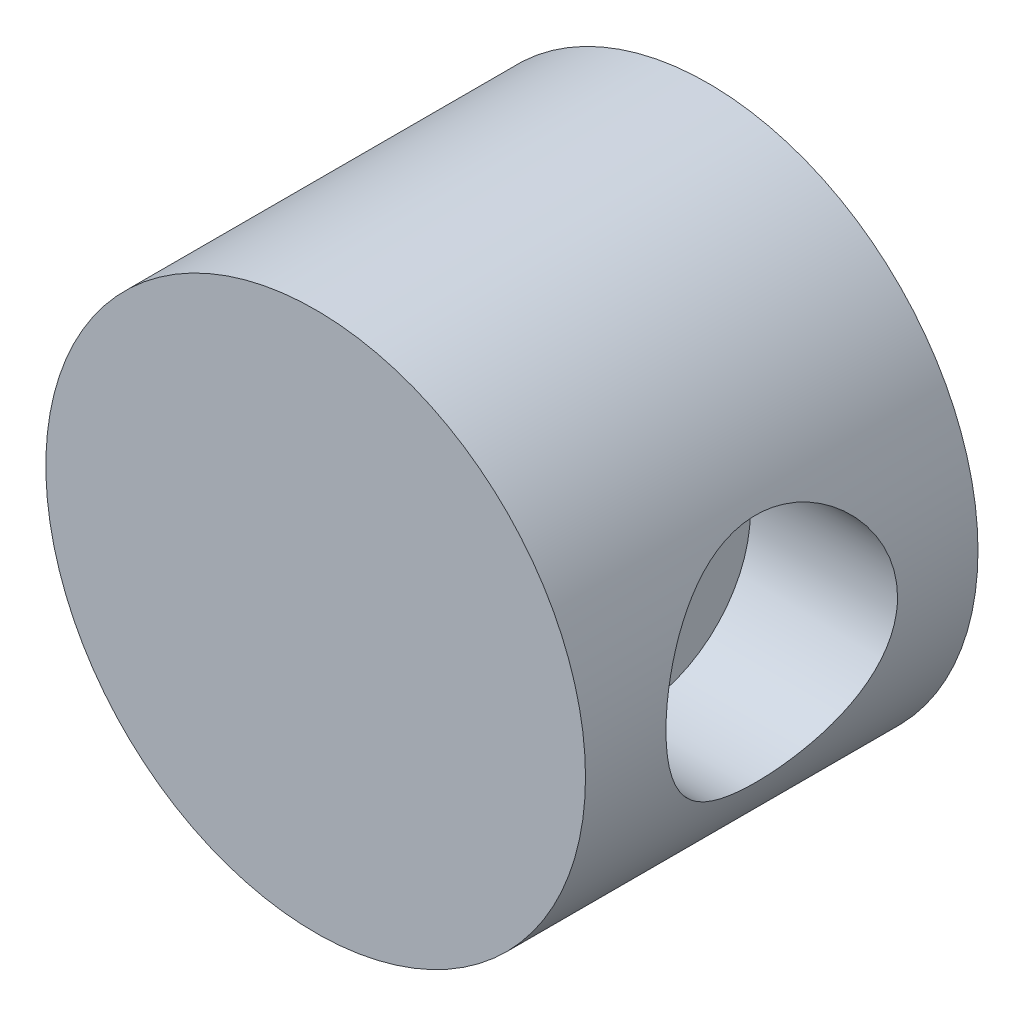
ISO-10303-21;
HEADER;
FILE_DESCRIPTION(('STEP AP214'),'2;1');
FILE_NAME('part.step','',(''),(''),'','','');
FILE_SCHEMA(('AUTOMOTIVE_DESIGN { 1 0 10303 214 1 1 1 1 }'));
ENDSEC;
DATA;
#1=APPLICATION_CONTEXT('core data for automotive mechanical design processes');
#2=APPLICATION_PROTOCOL_DEFINITION('international standard','automotive_design',2000,#1);
#3=PRODUCT_CONTEXT('',#1,'mechanical');
#4=PRODUCT('Part','Part','',(#3));
#5=PRODUCT_RELATED_PRODUCT_CATEGORY('part','',(#4));
#6=PRODUCT_DEFINITION_FORMATION('','',#4);
#7=PRODUCT_DEFINITION_CONTEXT('part definition',#1,'design');
#8=PRODUCT_DEFINITION('design','',#6,#7);
#9=PRODUCT_DEFINITION_SHAPE('','',#8);
#10=(LENGTH_UNIT() NAMED_UNIT(*) SI_UNIT(.MILLI.,.METRE.));
#11=(NAMED_UNIT(*) PLANE_ANGLE_UNIT() SI_UNIT($,.RADIAN.));
#12=(NAMED_UNIT(*) SI_UNIT($,.STERADIAN.) SOLID_ANGLE_UNIT());
#13=UNCERTAINTY_MEASURE_WITH_UNIT(LENGTH_MEASURE(1.E-05),#10,'distance_accuracy_value','');
#14=(GEOMETRIC_REPRESENTATION_CONTEXT(3) GLOBAL_UNCERTAINTY_ASSIGNED_CONTEXT((#13)) GLOBAL_UNIT_ASSIGNED_CONTEXT((#10,
#11,#12)) REPRESENTATION_CONTEXT('',''));
#15=CARTESIAN_POINT('',(0.,0.,0.));
#16=DIRECTION('',(0.,0.,1.));
#17=DIRECTION('',(1.,0.,0.));
#18=AXIS2_PLACEMENT_3D('',#15,#16,#17);
#19=CARTESIAN_POINT('',(0.,0.,40.));
#20=DIRECTION('',(0.,0.,-1.));
#21=DIRECTION('',(-1.,0.,0.));
#22=AXIS2_PLACEMENT_3D('',#19,#20,#21);
#23=CYLINDRICAL_SURFACE('',#22,27.5);
#24=CARTESIAN_POINT('',(-27.5,0.,31.8005203569305));
#25=CARTESIAN_POINT('',(-27.4999981336846,-0.315359693525762,31.800518073135));
#26=CARTESIAN_POINT('',(-27.4945607596565,-0.630814444526596,31.7878618792877));
#27=CARTESIAN_POINT('',(-27.4729463320535,-1.25946707724972,31.7373577506397));
#28=CARTESIAN_POINT('',(-27.456762773426,-1.57266347575706,31.6994945570981));
#29=CARTESIAN_POINT('',(-27.4140342077264,-2.19504661075172,31.5988634095722));
#30=CARTESIAN_POINT('',(-27.3874658935643,-2.50422270002216,31.5360394294279));
#31=CARTESIAN_POINT('',(-27.3246704145355,-3.11557628219286,31.386154666583));
#32=CARTESIAN_POINT('',(-27.2884446683448,-3.41775479595594,31.2990974436613));
#33=CARTESIAN_POINT('',(-27.20739959604,-4.01211457873237,31.1019330014046));
#34=CARTESIAN_POINT('',(-27.1626104788594,-4.30432685771354,30.9919066881672));
#35=CARTESIAN_POINT('',(-27.065460743841,-4.87806343387693,30.7495935202107));
#36=CARTESIAN_POINT('',(-27.0130998712882,-5.15958737109961,30.6173059165945));
#37=CARTESIAN_POINT('',(-26.902091151425,-5.71019537892871,30.3316068420219));
#38=CARTESIAN_POINT('',(-26.8434467501887,-5.97928615352326,30.1782069366799));
#39=CARTESIAN_POINT('',(-26.72119123301,-6.50388482788081,29.8512604812938));
#40=CARTESIAN_POINT('',(-26.6575781773591,-6.75938735685189,29.6777060501428));
#41=CARTESIAN_POINT('',(-26.5237432096869,-7.26727315066893,29.3028664791824));
#42=CARTESIAN_POINT('',(-26.4533508115496,-7.51892720586427,29.1006538460798));
#43=CARTESIAN_POINT('',(-26.3104586772991,-8.00461646980465,28.6765426301811));
#44=CARTESIAN_POINT('',(-26.2379579936512,-8.23864358131999,28.4546351009398));
#45=CARTESIAN_POINT('',(-26.0926784298815,-8.68779997703191,27.9923898963788));
#46=CARTESIAN_POINT('',(-26.0198994673949,-8.902923126952,27.7520462856455));
#47=CARTESIAN_POINT('',(-25.875961430425,-9.31299358560379,27.2542690881751));
#48=CARTESIAN_POINT('',(-25.8048023586208,-9.50794086096864,26.9968354731758));
#49=CARTESIAN_POINT('',(-25.6623057875844,-9.88630803182479,26.452050268744));
#50=CARTESIAN_POINT('',(-25.5911608089139,-10.0685602366403,26.1638354334961));
#51=CARTESIAN_POINT('',(-25.4550362112642,-10.4079084476309,25.5717239065551));
#52=CARTESIAN_POINT('',(-25.3900540336548,-10.5650149124404,25.2678338044352));
#53=CARTESIAN_POINT('',(-25.2684037105102,-10.8527501223478,24.6462200437315));
#54=CARTESIAN_POINT('',(-25.211733929166,-10.9833840789466,24.3284991229376));
#55=CARTESIAN_POINT('',(-25.1087295518504,-11.2168626552605,23.681380259549));
#56=CARTESIAN_POINT('',(-25.0623941336628,-11.3197094858957,23.3519832483388));
#57=CARTESIAN_POINT('',(-24.9838533512609,-11.4919790929248,22.7008084111394));
#58=CARTESIAN_POINT('',(-24.9510557921188,-11.562819685129,22.3794772117039));
#59=CARTESIAN_POINT('',(-24.8975865124204,-11.6775086344832,21.7310291287903));
#60=CARTESIAN_POINT('',(-24.876914397292,-11.721357869957,21.4039124339341));
#61=CARTESIAN_POINT('',(-24.8484944152445,-11.7814870306096,20.7467628982505));
#62=CARTESIAN_POINT('',(-24.8407398851411,-11.7977811694002,20.4167316491947));
#63=CARTESIAN_POINT('',(-24.8384394740922,-11.8026242980561,19.7564288279257));
#64=CARTESIAN_POINT('',(-24.8438928327098,-11.7911748852409,19.4261572706425));
#65=CARTESIAN_POINT('',(-24.8668024955632,-11.7427746617833,18.7953391180539));
#66=CARTESIAN_POINT('',(-24.8832331253325,-11.708002066034,18.4945848939776));
#67=CARTESIAN_POINT('',(-24.9264923756955,-11.6156178399036,17.8973855521384));
#68=CARTESIAN_POINT('',(-24.9533203354498,-11.558007661041,17.6009401617542));
#69=CARTESIAN_POINT('',(-25.0165395049643,-11.4205281392546,17.0142650179302));
#70=CARTESIAN_POINT('',(-25.0529321536717,-11.3406554469663,16.7240362068468));
#71=CARTESIAN_POINT('',(-25.1341925411445,-11.1594004389498,16.1515965995857));
#72=CARTESIAN_POINT('',(-25.179060628662,-11.058017238074,15.8693861339012));
#73=CARTESIAN_POINT('',(-25.2770532388276,-10.8321764542502,15.3085628126987));
#74=CARTESIAN_POINT('',(-25.3303351801876,-10.7072677264411,15.0301593670838));
#75=CARTESIAN_POINT('',(-25.4429678957688,-10.436802240301,14.484735576817));
#76=CARTESIAN_POINT('',(-25.5023208725636,-10.2912379806663,14.2177194136118));
#77=CARTESIAN_POINT('',(-25.625544138322,-9.98045211726002,13.6964333528167));
#78=CARTESIAN_POINT('',(-25.6894150676427,-9.81522772466421,13.4421652708528));
#79=CARTESIAN_POINT('',(-25.8200983635288,-9.46611107967004,12.9475776892844));
#80=CARTESIAN_POINT('',(-25.88691090509,-9.2822177158077,12.7072590215037));
#81=CARTESIAN_POINT('',(-26.0280192955457,-8.87928995643484,12.220597541512));
#82=CARTESIAN_POINT('',(-26.1024453832148,-8.65858151554555,11.9756760992904));
#83=CARTESIAN_POINT('',(-26.250900664879,-8.19749031575243,11.5051845403594));
#84=CARTESIAN_POINT('',(-26.3249300000992,-7.95711513221708,11.2796070405554));
#85=CARTESIAN_POINT('',(-26.4707304989759,-7.45775536775612,10.8488823828617));
#86=CARTESIAN_POINT('',(-26.5425000722295,-7.19875808387329,10.64374940311));
#87=CARTESIAN_POINT('',(-26.6818233780515,-6.66383161935828,10.2555247070997));
#88=CARTESIAN_POINT('',(-26.7493788157012,-6.38790937754001,10.0724240481201));
#89=CARTESIAN_POINT('',(-26.8802161760553,-5.81318064320936,9.72503651996358));
#90=CARTESIAN_POINT('',(-26.9433402049143,-5.51396446840991,9.56136664154595));
#91=CARTESIAN_POINT('',(-27.0615209798565,-4.90116723565635,9.2600084181058));
#92=CARTESIAN_POINT('',(-27.116577498726,-4.58758577344392,9.1223208048177));
#93=CARTESIAN_POINT('',(-27.2169906783099,-3.94841852491678,8.87436686586986));
#94=CARTESIAN_POINT('',(-27.2623519292843,-3.62283850535029,8.7640875596021));
#95=CARTESIAN_POINT('',(-27.3420368907614,-2.96204733999575,8.57209984883751));
#96=CARTESIAN_POINT('',(-27.3763614977091,-2.62683697883725,8.49038912382679));
#97=CARTESIAN_POINT('',(-27.4310376415615,-1.97202191360785,8.36095776222526));
#98=CARTESIAN_POINT('',(-27.4521644663649,-1.65285528154501,8.31134336314416));
#99=CARTESIAN_POINT('',(-27.4832877721504,-1.01099294083774,8.23843200196534));
#100=CARTESIAN_POINT('',(-27.4932847434176,-0.688297388279497,8.21513388059909));
#101=CARTESIAN_POINT('',(-27.5018662976328,-0.0420189674608372,8.19512765533144));
#102=CARTESIAN_POINT('',(-27.5004539235616,0.281563641198773,8.19841246151114));
#103=CARTESIAN_POINT('',(-27.4862635846183,0.927112360096872,8.23151700186176));
#104=CARTESIAN_POINT('',(-27.4734859013534,1.24907851018885,8.2613360785722));
#105=CARTESIAN_POINT('',(-27.4379035510791,1.8717543492612,8.34486516407671));
#106=CARTESIAN_POINT('',(-27.4156709656317,2.17268079190398,8.39721388063256));
#107=CARTESIAN_POINT('',(-27.3618985964477,2.76876361958969,8.52484752195865));
#108=CARTESIAN_POINT('',(-27.3303592267556,3.06392026069945,8.60013142638264));
#109=CARTESIAN_POINT('',(-27.2587326099299,3.64659778809436,8.77293616326065));
#110=CARTESIAN_POINT('',(-27.2186447516134,3.93411812676054,8.87045858571474));
#111=CARTESIAN_POINT('',(-27.1308647000425,4.4997909529933,9.08689410475198));
#112=CARTESIAN_POINT('',(-27.0831722217244,4.77794308891363,9.20580800322873));
#113=CARTESIAN_POINT('',(-26.9796918508587,5.331794910342,9.46809512031005));
#114=CARTESIAN_POINT('',(-26.9236987776532,5.60715105368804,9.612112485434));
#115=CARTESIAN_POINT('',(-26.8060905137521,6.14485910300472,9.92085597421787));
#116=CARTESIAN_POINT('',(-26.7444732917766,6.40720625728827,10.085589588168));
#117=CARTESIAN_POINT('',(-26.6170479237938,6.91750963360055,10.4346499099423));
#118=CARTESIAN_POINT('',(-26.5512390517016,7.16546334807651,10.6189800160253));
#119=CARTESIAN_POINT('',(-26.4169423560663,7.64574046381944,11.0061087074266));
#120=CARTESIAN_POINT('',(-26.3484543926779,7.8780630474341,11.2089082575633));
#121=CARTESIAN_POINT('',(-26.2051408773667,8.34290911278394,11.6478794860065));
#122=CARTESIAN_POINT('',(-26.1302276923771,8.57411949491422,11.8854150619756));
#123=CARTESIAN_POINT('',(-25.9811206708011,9.01585980507216,12.3792186885803));
#124=CARTESIAN_POINT('',(-25.9069268667099,9.22638880278797,12.6354875809942));
#125=CARTESIAN_POINT('',(-25.7612965026287,9.62552605653066,13.1654128377798));
#126=CARTESIAN_POINT('',(-25.6898606124898,9.81412900918421,13.4390733841128));
#127=CARTESIAN_POINT('',(-25.5518325981401,10.1680850051094,14.0022544780809));
#128=CARTESIAN_POINT('',(-25.4852410075853,10.3334354887178,14.2917767669309));
#129=CARTESIAN_POINT('',(-25.3577989599797,10.6423909986829,14.8904663806869));
#130=CARTESIAN_POINT('',(-25.2970769247382,10.7855391132524,15.1998974163615));
#131=CARTESIAN_POINT('',(-25.1849018514785,11.0449400122799,15.8313064568411));
#132=CARTESIAN_POINT('',(-25.133444525616,11.1612052456505,16.15327857309));
#133=CARTESIAN_POINT('',(-25.0416756843672,11.3656079310105,16.8074167083928));
#134=CARTESIAN_POINT('',(-25.0013585612847,11.4537595381469,17.1395775048249));
#135=CARTESIAN_POINT('',(-24.9334175435301,11.6009175444582,17.8115624851285));
#136=CARTESIAN_POINT('',(-24.905792350628,11.6599269245748,18.1513858814771));
#137=CARTESIAN_POINT('',(-24.8660344374857,11.7444589199865,18.8081181264052));
#138=CARTESIAN_POINT('',(-24.8528323580021,11.7722975028192,19.1246658995802));
#139=CARTESIAN_POINT('',(-24.8385807523395,11.8023385093588,19.7592428529976));
#140=CARTESIAN_POINT('',(-24.8375305450897,11.8045423698041,20.0772719492174));
#141=CARTESIAN_POINT('',(-24.8476199121212,11.7832897486026,20.712220755723));
#142=CARTESIAN_POINT('',(-24.8587575571193,11.7598373282321,21.0291406336277));
#143=CARTESIAN_POINT('',(-24.8928179941944,11.6875661566332,21.6594263815949));
#144=CARTESIAN_POINT('',(-24.9157406551491,11.6387476876324,21.97279229116));
#145=CARTESIAN_POINT('',(-24.9710666172275,11.5195440351879,22.5772541486782));
#146=CARTESIAN_POINT('',(-25.0029072147929,11.4504296780011,22.8686539475978));
#147=CARTESIAN_POINT('',(-25.0754904116916,11.2905925324951,23.4444302123539));
#148=CARTESIAN_POINT('',(-25.1162360666285,11.1998623261374,23.7288042300537));
#149=CARTESIAN_POINT('',(-25.2054562017099,10.9975989553038,24.2887911350942));
#150=CARTESIAN_POINT('',(-25.2539306963139,10.8860657519086,24.5644040060428));
#151=CARTESIAN_POINT('',(-25.3573028936448,10.643054864418,25.1054506085304));
#152=CARTESIAN_POINT('',(-25.4122010900731,10.5115756471168,25.3708835555944));
#153=CARTESIAN_POINT('',(-25.530588763318,10.2208205024736,25.9064037211142));
#154=CARTESIAN_POINT('',(-25.5943999053574,10.0603263628233,26.1757586331021));
#155=CARTESIAN_POINT('',(-25.7259746545615,9.71893436731351,26.7001866816035));
#156=CARTESIAN_POINT('',(-25.7937383830875,9.53803588479376,26.9552593791197));
#157=CARTESIAN_POINT('',(-25.9315069194049,9.15685642295699,27.449952330037));
#158=CARTESIAN_POINT('',(-26.00151232348,8.95657025738712,27.689568420034));
#159=CARTESIAN_POINT('',(-26.1420420910476,8.53770689317832,28.1521293980692));
#160=CARTESIAN_POINT('',(-26.2125665239412,8.31912720637794,28.3750720104591));
#161=CARTESIAN_POINT('',(-26.3580112717159,7.84672271864387,28.8201317465053));
#162=CARTESIAN_POINT('',(-26.4328356026907,7.5914774296087,29.0407756569632));
#163=CARTESIAN_POINT('',(-26.5790534397913,7.06251930044783,29.4597514335358));
#164=CARTESIAN_POINT('',(-26.6504481420655,6.78881298021108,29.6580911115185));
#165=CARTESIAN_POINT('',(-26.7879347274466,6.22422802928004,30.031243222346));
#166=CARTESIAN_POINT('',(-26.8540226766119,5.93333693162152,30.2060382652055));
#167=CARTESIAN_POINT('',(-26.9789922188971,5.33637944743056,30.5304661537099));
#168=CARTESIAN_POINT('',(-27.03787438677,5.0303142739639,30.6801010065571));
#169=CARTESIAN_POINT('',(-27.1459678557145,4.40956184386803,30.9508464085512));
#170=CARTESIAN_POINT('',(-27.1953066892821,4.09506326595642,31.0723381424544));
#171=CARTESIAN_POINT('',(-27.2839505691409,3.4554684082484,31.2883101981054));
#172=CARTESIAN_POINT('',(-27.3232539812619,3.13037041214785,31.3827861208927));
#173=CARTESIAN_POINT('',(-27.3905595961472,2.47307536330899,31.5434110996355));
#174=CARTESIAN_POINT('',(-27.4185928630186,2.1409005186601,31.6096380499537));
#175=CARTESIAN_POINT('',(-27.4626496308576,1.47147024241425,31.7133098858548));
#176=CARTESIAN_POINT('',(-27.4786817376231,1.13421862864034,31.7507753961987));
#177=CARTESIAN_POINT('',(-27.4923149001208,0.663496081326161,31.7826015574181));
#178=CARTESIAN_POINT('',(-27.495194958019,0.530908724201248,31.7893189654418));
#179=CARTESIAN_POINT('',(-27.4990379069738,0.265553196414928,31.7982788602444));
#180=CARTESIAN_POINT('',(-27.5000007858288,0.132785024608134,31.800521318543));
#181=CARTESIAN_POINT('',(-27.5,0.,31.8005203569305));
#182=B_SPLINE_CURVE_WITH_KNOTS('',3,(#24,#25,#26,#27,#28,#29,#30,#31,#32,#33,#34,#35,#36,#37,
#38,#39,#40,#41,#42,#43,#44,#45,#46,#47,#48,#49,#50,#51,#52,#53,#54,#55,#56,#57,#58,#59,#60,#61,
#62,#63,#64,#65,#66,#67,#68,#69,#70,#71,#72,#73,#74,#75,#76,#77,#78,#79,#80,#81,#82,#83,#84,#85,
#86,#87,#88,#89,#90,#91,#92,#93,#94,#95,#96,#97,#98,#99,#100,#101,#102,#103,#104,#105,#106,#107,
#108,#109,#110,#111,#112,#113,#114,#115,#116,#117,#118,#119,#120,#121,#122,#123,#124,#125,#126,
#127,#128,#129,#130,#131,#132,#133,#134,#135,#136,#137,#138,#139,#140,#141,#142,#143,#144,#145,
#146,#147,#148,#149,#150,#151,#152,#153,#154,#155,#156,#157,#158,#159,#160,#161,#162,#163,#164,
#165,#166,#167,#168,#169,#170,#171,#172,#173,#174,#175,#176,#177,#178,#179,#180,#181),
.UNSPECIFIED.,.T.,.F.,(4,2,2,2,2,2,2,2,2,2,2,2,2,2,2,2,2,2,2,2,2,2,2,2,2,2,2,2,2,2,2,2,2,2,2,2,
2,2,2,2,2,2,2,2,2,2,2,2,2,2,2,2,2,2,2,2,2,2,2,2,2,2,2,2,2,2,2,2,2,2,2,2,2,2,2,2,2,2,4),(0.,
0.945944814906931,1.89246276693154,2.84111735411139,3.78963266071268,4.73486165725625,
5.68012245881936,6.62486747928232,7.56998317918924,8.56014920812009,9.55076734678675,
10.5417057599803,11.5326458119604,12.5763863299863,13.6196916002426,14.6627912806206,
15.7058079409094,16.6965055083798,17.6871708359291,18.6773249973408,19.6674221525327,
20.5759656346429,21.4844513805066,22.3930738806396,23.3017337774273,24.2300226505781,
25.1586495098625,26.0874082538759,27.0162223243405,28.0290515502029,29.0414924679674,
30.0546306912927,31.06735629377,32.1065576004454,33.1457881696164,34.1845256159832,
35.2231786701657,36.1929961781953,37.162770962752,38.1322871077019,39.1017792308567,
40.0194830879426,40.9371461239557,41.8548747912328,42.7726378682046,43.7188614764003,
44.6654281958204,45.6121593294596,46.5589399474285,47.577310198921,48.5957262388623,
49.6143880984429,50.6331620060649,51.6707111576524,52.7077788748572,53.7443236034366,
54.7807622824828,55.7336518786826,56.6864880684284,57.6391734502213,58.5918482324719,
59.494364229172,60.3971903948879,61.3000182496728,62.2029155380284,63.1618099333642,
64.120733786388,65.079914866518,66.039226620675,67.0747648734038,68.1099393005597,
69.1458741598787,70.1817263362613,71.2025996314426,72.223639059985,73.2418445594508,
74.2593192223359,74.6576152275074,75.0559137675682),.UNSPECIFIED.);
#183=CARTESIAN_POINT('',(-27.5,0.,31.8005203569305));
#184=VERTEX_POINT('',#183);
#185=EDGE_CURVE('E41',#184,#184,#182,.T.);
#186=ORIENTED_EDGE('',*,*,#185,.T.);
#187=EDGE_LOOP('',(#186));
#188=FACE_BOUND('',#187,.T.);
#189=CARTESIAN_POINT('',(0.,0.,40.));
#190=DIRECTION('',(0.,0.,1.));
#191=DIRECTION('',(1.,0.,0.));
#192=AXIS2_PLACEMENT_3D('',#189,#190,#191);
#193=CIRCLE('',#192,27.5);
#194=CARTESIAN_POINT('',(27.5,0.,40.));
#195=VERTEX_POINT('',#194);
#196=EDGE_CURVE('E45',#195,#195,#193,.T.);
#197=ORIENTED_EDGE('',*,*,#196,.F.);
#198=EDGE_LOOP('',(#197));
#199=FACE_BOUND('',#198,.T.);
#200=CARTESIAN_POINT('',(0.,0.,0.));
#201=DIRECTION('',(0.,0.,1.));
#202=DIRECTION('',(1.,0.,0.));
#203=AXIS2_PLACEMENT_3D('',#200,#201,#202);
#204=CIRCLE('',#203,27.5);
#205=CARTESIAN_POINT('',(27.5,0.,0.));
#206=VERTEX_POINT('',#205);
#207=EDGE_CURVE('E49',#206,#206,#204,.T.);
#208=ORIENTED_EDGE('',*,*,#207,.T.);
#209=EDGE_LOOP('',(#208));
#210=FACE_BOUND('',#209,.T.);
#211=CARTESIAN_POINT('',(27.5,0.,8.19947964306954));
#212=CARTESIAN_POINT('',(27.4999981336846,0.315359693525761,8.19948192686497));
#213=CARTESIAN_POINT('',(27.4945607596565,0.630814444526596,8.21213812071227));
#214=CARTESIAN_POINT('',(27.4729463320535,1.25946707724972,8.26264224936029));
#215=CARTESIAN_POINT('',(27.456762773426,1.57266347575706,8.30050544290192));
#216=CARTESIAN_POINT('',(27.4140342077264,2.19504661075172,8.40113659042777));
#217=CARTESIAN_POINT('',(27.3874658935643,2.50422270002216,8.46396057057212));
#218=CARTESIAN_POINT('',(27.3246704145355,3.11557628219286,8.61384533341702));
#219=CARTESIAN_POINT('',(27.2884446683448,3.41775479595594,8.70090255633867));
#220=CARTESIAN_POINT('',(27.20739959604,4.01211457873237,8.89806699859545));
#221=CARTESIAN_POINT('',(27.1626104788594,4.30432685771354,9.00809331183284));
#222=CARTESIAN_POINT('',(27.065460743841,4.87806343387693,9.25040647978932));
#223=CARTESIAN_POINT('',(27.0130998712882,5.15958737109961,9.38269408340548));
#224=CARTESIAN_POINT('',(26.902091151425,5.71019537892871,9.66839315797811));
#225=CARTESIAN_POINT('',(26.8434467501887,5.97928615352326,9.82179306332014));
#226=CARTESIAN_POINT('',(26.72119123301,6.50388482788081,10.1487395187062));
#227=CARTESIAN_POINT('',(26.6575781773591,6.75938735685189,10.3222939498572));
#228=CARTESIAN_POINT('',(26.5237432096869,7.26727315066893,10.6971335208176));
#229=CARTESIAN_POINT('',(26.4533508115496,7.51892720586427,10.8993461539202));
#230=CARTESIAN_POINT('',(26.3104586772991,8.00461646980465,11.3234573698189));
#231=CARTESIAN_POINT('',(26.2379579936512,8.23864358131999,11.5453648990602));
#232=CARTESIAN_POINT('',(26.0926784298815,8.68779997703191,12.0076101036212));
#233=CARTESIAN_POINT('',(26.0198994673949,8.902923126952,12.2479537143545));
#234=CARTESIAN_POINT('',(25.875961430425,9.31299358560379,12.7457309118249));
#235=CARTESIAN_POINT('',(25.8048023586208,9.50794086096865,13.0031645268242));
#236=CARTESIAN_POINT('',(25.6623057875844,9.88630803182479,13.547949731256));
#237=CARTESIAN_POINT('',(25.5911608089139,10.0685602366403,13.8361645665039));
#238=CARTESIAN_POINT('',(25.4550362112642,10.4079084476309,14.4282760934449));
#239=CARTESIAN_POINT('',(25.3900540336548,10.5650149124404,14.7321661955648));
#240=CARTESIAN_POINT('',(25.2684037105102,10.8527501223478,15.3537799562685));
#241=CARTESIAN_POINT('',(25.211733929166,10.9833840789466,15.6715008770624));
#242=CARTESIAN_POINT('',(25.1087295518504,11.2168626552605,16.318619740451));
#243=CARTESIAN_POINT('',(25.0623941336628,11.3197094858957,16.6480167516612));
#244=CARTESIAN_POINT('',(24.9838533512609,11.4919790929248,17.2991915888606));
#245=CARTESIAN_POINT('',(24.9510557921188,11.562819685129,17.6205227882961));
#246=CARTESIAN_POINT('',(24.8975865124204,11.6775086344832,18.2689708712097));
#247=CARTESIAN_POINT('',(24.876914397292,11.721357869957,18.5960875660659));
#248=CARTESIAN_POINT('',(24.8484944152445,11.7814870306096,19.2532371017495));
#249=CARTESIAN_POINT('',(24.8407398851411,11.7977811694002,19.5832683508053));
#250=CARTESIAN_POINT('',(24.8384394740922,11.8026242980561,20.2435711720743));
#251=CARTESIAN_POINT('',(24.8438928327098,11.7911748852409,20.5738427293575));
#252=CARTESIAN_POINT('',(24.8668024955632,11.7427746617833,21.2046608819461));
#253=CARTESIAN_POINT('',(24.8832331253325,11.708002066034,21.5054151060224));
#254=CARTESIAN_POINT('',(24.9264923756955,11.6156178399036,22.1026144478616));
#255=CARTESIAN_POINT('',(24.9533203354498,11.558007661041,22.3990598382458));
#256=CARTESIAN_POINT('',(25.0165395049643,11.4205281392546,22.9857349820698));
#257=CARTESIAN_POINT('',(25.0529321536717,11.3406554469663,23.2759637931532));
#258=CARTESIAN_POINT('',(25.1341925411445,11.1594004389498,23.8484034004143));
#259=CARTESIAN_POINT('',(25.179060628662,11.058017238074,24.1306138660988));
#260=CARTESIAN_POINT('',(25.2770532388276,10.8321764542502,24.6914371873013));
#261=CARTESIAN_POINT('',(25.3303351801876,10.7072677264411,24.9698406329162));
#262=CARTESIAN_POINT('',(25.4429678957688,10.436802240301,25.515264423183));
#263=CARTESIAN_POINT('',(25.5023208725636,10.2912379806664,25.7822805863882));
#264=CARTESIAN_POINT('',(25.625544138322,9.98045211726002,26.3035666471833));
#265=CARTESIAN_POINT('',(25.6894150676427,9.81522772466421,26.5578347291472));
#266=CARTESIAN_POINT('',(25.8200983635288,9.46611107967004,27.0524223107156));
#267=CARTESIAN_POINT('',(25.88691090509,9.2822177158077,27.2927409784963));
#268=CARTESIAN_POINT('',(26.0280192955457,8.87928995643484,27.779402458488));
#269=CARTESIAN_POINT('',(26.1024453832148,8.65858151554555,28.0243239007096));
#270=CARTESIAN_POINT('',(26.250900664879,8.19749031575243,28.4948154596406));
#271=CARTESIAN_POINT('',(26.3249300000992,7.95711513221708,28.7203929594446));
#272=CARTESIAN_POINT('',(26.4707304989759,7.45775536775612,29.1511176171383));
#273=CARTESIAN_POINT('',(26.5425000722295,7.19875808387329,29.35625059689));
#274=CARTESIAN_POINT('',(26.6818233780515,6.66383161935828,29.7444752929003));
#275=CARTESIAN_POINT('',(26.7493788157012,6.38790937754001,29.9275759518799));
#276=CARTESIAN_POINT('',(26.8802161760553,5.81318064320936,30.2749634800364));
#277=CARTESIAN_POINT('',(26.9433402049143,5.51396446840991,30.4386333584541));
#278=CARTESIAN_POINT('',(27.0615209798565,4.90116723565635,30.7399915818942));
#279=CARTESIAN_POINT('',(27.116577498726,4.58758577344392,30.8776791951823));
#280=CARTESIAN_POINT('',(27.2169906783099,3.94841852491677,31.1256331341301));
#281=CARTESIAN_POINT('',(27.2623519292843,3.62283850535029,31.2359124403979));
#282=CARTESIAN_POINT('',(27.3420368907614,2.96204733999575,31.4279001511625));
#283=CARTESIAN_POINT('',(27.3763614977092,2.62683697883725,31.5096108761732));
#284=CARTESIAN_POINT('',(27.4310376415615,1.97202191360786,31.6390422377747));
#285=CARTESIAN_POINT('',(27.4521644663649,1.65285528154501,31.6886566368558));
#286=CARTESIAN_POINT('',(27.4832877721504,1.01099294083774,31.7615679980347));
#287=CARTESIAN_POINT('',(27.4932847434176,0.688297388279501,31.7848661194009));
#288=CARTESIAN_POINT('',(27.5018662976328,0.0420189674608439,31.8048723446686));
#289=CARTESIAN_POINT('',(27.5004539235616,-0.281563641198765,31.8015875384889));
#290=CARTESIAN_POINT('',(27.4862635846183,-0.927112360096864,31.7684829981382));
#291=CARTESIAN_POINT('',(27.4734859013534,-1.24907851018884,31.7386639214278));
#292=CARTESIAN_POINT('',(27.4379035510791,-1.8717543492612,31.6551348359233));
#293=CARTESIAN_POINT('',(27.4156709656317,-2.17268079190398,31.6027861193674));
#294=CARTESIAN_POINT('',(27.3618985964477,-2.76876361958968,31.4751524780414));
#295=CARTESIAN_POINT('',(27.3303592267556,-3.06392026069944,31.3998685736174));
#296=CARTESIAN_POINT('',(27.2587326099299,-3.64659778809436,31.2270638367394));
#297=CARTESIAN_POINT('',(27.2186447516134,-3.93411812676054,31.1295414142853));
#298=CARTESIAN_POINT('',(27.1308647000425,-4.4997909529933,30.913105895248));
#299=CARTESIAN_POINT('',(27.0831722217244,-4.77794308891362,30.7941919967713));
#300=CARTESIAN_POINT('',(26.9796918508587,-5.331794910342,30.5319048796899));
#301=CARTESIAN_POINT('',(26.9236987776532,-5.60715105368804,30.387887514566));
#302=CARTESIAN_POINT('',(26.8060905137521,-6.14485910300472,30.0791440257821));
#303=CARTESIAN_POINT('',(26.7444732917766,-6.40720625728827,29.914410411832));
#304=CARTESIAN_POINT('',(26.6170479237938,-6.91750963360055,29.5653500900577));
#305=CARTESIAN_POINT('',(26.5512390517016,-7.16546334807651,29.3810199839747));
#306=CARTESIAN_POINT('',(26.4169423560663,-7.64574046381944,28.9938912925734));
#307=CARTESIAN_POINT('',(26.3484543926779,-7.8780630474341,28.7910917424367));
#308=CARTESIAN_POINT('',(26.2051408773667,-8.34290911278393,28.3521205139935));
#309=CARTESIAN_POINT('',(26.1302276923771,-8.57411949491421,28.1145849380244));
#310=CARTESIAN_POINT('',(25.9811206708011,-9.01585980507216,27.6207813114197));
#311=CARTESIAN_POINT('',(25.9069268667099,-9.22638880278797,27.3645124190058));
#312=CARTESIAN_POINT('',(25.7612965026287,-9.62552605653066,26.8345871622203));
#313=CARTESIAN_POINT('',(25.6898606124898,-9.8141290091842,26.5609266158872));
#314=CARTESIAN_POINT('',(25.5518325981401,-10.1680850051094,25.9977455219192));
#315=CARTESIAN_POINT('',(25.4852410075853,-10.3334354887178,25.7082232330691));
#316=CARTESIAN_POINT('',(25.3577989599797,-10.6423909986829,25.1095336193131));
#317=CARTESIAN_POINT('',(25.2970769247382,-10.7855391132524,24.8001025836385));
#318=CARTESIAN_POINT('',(25.1849018514785,-11.0449400122799,24.1686935431589));
#319=CARTESIAN_POINT('',(25.133444525616,-11.1612052456505,23.84672142691));
#320=CARTESIAN_POINT('',(25.0416756843672,-11.3656079310105,23.1925832916072));
#321=CARTESIAN_POINT('',(25.0013585612847,-11.4537595381469,22.8604224951751));
#322=CARTESIAN_POINT('',(24.9334175435301,-11.6009175444582,22.1884375148715));
#323=CARTESIAN_POINT('',(24.905792350628,-11.6599269245748,21.8486141185229));
#324=CARTESIAN_POINT('',(24.8660344374857,-11.7444589199865,21.1918818735948));
#325=CARTESIAN_POINT('',(24.8528323580021,-11.7722975028192,20.8753341004198));
#326=CARTESIAN_POINT('',(24.8385807523395,-11.8023385093588,20.2407571470024));
#327=CARTESIAN_POINT('',(24.8375305450897,-11.8045423698041,19.9227280507827));
#328=CARTESIAN_POINT('',(24.8476199121212,-11.7832897486026,19.287779244277));
#329=CARTESIAN_POINT('',(24.8587575571193,-11.7598373282321,18.9708593663723));
#330=CARTESIAN_POINT('',(24.8928179941944,-11.6875661566332,18.3405736184051));
#331=CARTESIAN_POINT('',(24.9157406551491,-11.6387476876324,18.02720770884));
#332=CARTESIAN_POINT('',(24.9710666172275,-11.5195440351879,17.4227458513218));
#333=CARTESIAN_POINT('',(25.0029072147929,-11.4504296780011,17.1313460524022));
#334=CARTESIAN_POINT('',(25.0754904116916,-11.2905925324951,16.5555697876461));
#335=CARTESIAN_POINT('',(25.1162360666285,-11.1998623261374,16.2711957699463));
#336=CARTESIAN_POINT('',(25.2054562017099,-10.9975989553038,15.7112088649058));
#337=CARTESIAN_POINT('',(25.2539306963139,-10.8860657519086,15.4355959939572));
#338=CARTESIAN_POINT('',(25.3573028936448,-10.643054864418,14.8945493914696));
#339=CARTESIAN_POINT('',(25.4122010900731,-10.5115756471168,14.6291164444056));
#340=CARTESIAN_POINT('',(25.530588763318,-10.2208205024736,14.0935962788858));
#341=CARTESIAN_POINT('',(25.5943999053574,-10.0603263628233,13.8242413668979));
#342=CARTESIAN_POINT('',(25.7259746545615,-9.71893436731351,13.2998133183966));
#343=CARTESIAN_POINT('',(25.7937383830875,-9.53803588479376,13.0447406208803));
#344=CARTESIAN_POINT('',(25.9315069194049,-9.15685642295699,12.550047669963));
#345=CARTESIAN_POINT('',(26.00151232348,-8.95657025738712,12.310431579966));
#346=CARTESIAN_POINT('',(26.1420420910476,-8.53770689317832,11.8478706019308));
#347=CARTESIAN_POINT('',(26.2125665239412,-8.31912720637794,11.6249279895409));
#348=CARTESIAN_POINT('',(26.3580112717159,-7.84672271864387,11.1798682534947));
#349=CARTESIAN_POINT('',(26.4328356026907,-7.59147742960871,10.9592243430368));
#350=CARTESIAN_POINT('',(26.5790534397913,-7.06251930044784,10.5402485664642));
#351=CARTESIAN_POINT('',(26.6504481420655,-6.78881298021109,10.3419088884815));
#352=CARTESIAN_POINT('',(26.7879347274466,-6.22422802928005,9.96875677765398));
#353=CARTESIAN_POINT('',(26.8540226766119,-5.93333693162153,9.79396173479449));
#354=CARTESIAN_POINT('',(26.9789922188971,-5.33637944743057,9.46953384629009));
#355=CARTESIAN_POINT('',(27.03787438677,-5.03031427396392,9.31989899344287));
#356=CARTESIAN_POINT('',(27.1459678557145,-4.40956184386804,9.0491535914488));
#357=CARTESIAN_POINT('',(27.1953066892821,-4.09506326595642,8.9276618575456));
#358=CARTESIAN_POINT('',(27.2839505691409,-3.4554684082484,8.71168980189458));
#359=CARTESIAN_POINT('',(27.3232539812619,-3.13037041214786,8.6172138791073));
#360=CARTESIAN_POINT('',(27.3905595961472,-2.473075363309,8.45658890036454));
#361=CARTESIAN_POINT('',(27.4185928630186,-2.14090051866011,8.39036195004632));
#362=CARTESIAN_POINT('',(27.4626496308576,-1.47147024241426,8.28669011414516));
#363=CARTESIAN_POINT('',(27.4786817376231,-1.13421862864035,8.24922460380134));
#364=CARTESIAN_POINT('',(27.4923149001208,-0.663496081326165,8.21739844258193));
#365=CARTESIAN_POINT('',(27.495194958019,-0.530908724201248,8.21068103455817));
#366=CARTESIAN_POINT('',(27.4990379069738,-0.265553196414926,8.20172113975562));
#367=CARTESIAN_POINT('',(27.5000007858288,-0.132785024608133,8.19947868145701));
#368=CARTESIAN_POINT('',(27.5,0.,8.19947964306954));
#369=B_SPLINE_CURVE_WITH_KNOTS('',3,(#211,#212,#213,#214,#215,#216,#217,#218,#219,#220,#221,
#222,#223,#224,#225,#226,#227,#228,#229,#230,#231,#232,#233,#234,#235,#236,#237,#238,#239,#240,
#241,#242,#243,#244,#245,#246,#247,#248,#249,#250,#251,#252,#253,#254,#255,#256,#257,#258,#259,
#260,#261,#262,#263,#264,#265,#266,#267,#268,#269,#270,#271,#272,#273,#274,#275,#276,#277,#278,
#279,#280,#281,#282,#283,#284,#285,#286,#287,#288,#289,#290,#291,#292,#293,#294,#295,#296,#297,
#298,#299,#300,#301,#302,#303,#304,#305,#306,#307,#308,#309,#310,#311,#312,#313,#314,#315,#316,
#317,#318,#319,#320,#321,#322,#323,#324,#325,#326,#327,#328,#329,#330,#331,#332,#333,#334,#335,
#336,#337,#338,#339,#340,#341,#342,#343,#344,#345,#346,#347,#348,#349,#350,#351,#352,#353,#354,
#355,#356,#357,#358,#359,#360,#361,#362,#363,#364,#365,#366,#367,#368),.UNSPECIFIED.,.T.,.F.,(4,
2,2,2,2,2,2,2,2,2,2,2,2,2,2,2,2,2,2,2,2,2,2,2,2,2,2,2,2,2,2,2,2,2,2,2,2,2,2,2,2,2,2,2,2,2,2,2,2,
2,2,2,2,2,2,2,2,2,2,2,2,2,2,2,2,2,2,2,2,2,2,2,2,2,2,2,2,2,4),(0.,0.945944814906931,
1.89246276693154,2.84111735411139,3.78963266071268,4.73486165725625,5.68012245881936,
6.62486747928232,7.56998317918924,8.56014920812009,9.55076734678675,10.5417057599803,
11.5326458119604,12.5763863299863,13.6196916002426,14.6627912806206,15.7058079409094,
16.6965055083798,17.6871708359291,18.6773249973408,19.6674221525327,20.575965634643,
21.4844513805067,22.3930738806396,23.3017337774273,24.2300226505781,25.1586495098625,
26.0874082538759,27.0162223243405,28.0290515502029,29.0414924679674,30.0546306912928,
31.06735629377,32.1065576004455,33.1457881696165,34.1845256159832,35.2231786701657,
36.1929961781953,37.162770962752,38.1322871077019,39.1017792308567,40.0194830879426,
40.9371461239557,41.8548747912328,42.7726378682046,43.7188614764003,44.6654281958204,
45.6121593294596,46.5589399474285,47.577310198921,48.5957262388623,49.6143880984429,
50.6331620060649,51.6707111576524,52.7077788748572,53.7443236034366,54.7807622824828,
55.7336518786826,56.6864880684284,57.6391734502213,58.5918482324719,59.494364229172,
60.3971903948879,61.3000182496728,62.2029155380284,63.1618099333642,64.120733786388,
65.079914866518,66.039226620675,67.0747648734038,68.1099393005597,69.1458741598786,
70.1817263362612,71.2025996314426,72.223639059985,73.2418445594507,74.2593192223359,
74.6576152275073,75.0559137675682),.UNSPECIFIED.);
#370=CARTESIAN_POINT('',(27.5,0.,8.19947964306954));
#371=VERTEX_POINT('',#370);
#372=EDGE_CURVE('E10',#371,#371,#369,.T.);
#373=ORIENTED_EDGE('',*,*,#372,.F.);
#374=EDGE_LOOP('',(#373));
#375=FACE_BOUND('',#374,.T.);
#376=ADVANCED_FACE('F31',(#188,#199,#210,#375),#23,.T.);
#377=CARTESIAN_POINT('',(0.,0.,40.));
#378=DIRECTION('',(0.,0.,1.));
#379=DIRECTION('',(1.,0.,0.));
#380=AXIS2_PLACEMENT_3D('',#377,#378,#379);
#381=PLANE('',#380);
#382=ORIENTED_EDGE('',*,*,#196,.T.);
#383=EDGE_LOOP('',(#382));
#384=FACE_BOUND('',#383,.T.);
#385=ADVANCED_FACE('F63',(#384),#381,.T.);
#386=CARTESIAN_POINT('',(0.,0.,0.));
#387=DIRECTION('',(0.,0.,1.));
#388=DIRECTION('',(1.,0.,0.));
#389=AXIS2_PLACEMENT_3D('',#386,#387,#388);
#390=PLANE('',#389);
#391=ORIENTED_EDGE('',*,*,#207,.F.);
#392=EDGE_LOOP('',(#391));
#393=FACE_BOUND('',#392,.T.);
#394=ADVANCED_FACE('F61',(#393),#390,.F.);
#395=CARTESIAN_POINT('',(-12.5,0.,20.));
#396=DIRECTION('',(-1.,0.,0.));
#397=DIRECTION('',(0.,0.,1.));
#398=AXIS2_PLACEMENT_3D('',#395,#396,#397);
#399=CYLINDRICAL_SURFACE('',#398,11.8005203569305);
#400=CARTESIAN_POINT('',(-12.5,0.,20.));
#401=DIRECTION('',(-1.,0.,0.));
#402=DIRECTION('',(0.,0.,1.));
#403=AXIS2_PLACEMENT_3D('',#400,#401,#402);
#404=CIRCLE('',#403,11.8005203569305);
#405=CARTESIAN_POINT('',(-12.5,0.,31.8005203569305));
#406=VERTEX_POINT('',#405);
#407=EDGE_CURVE('E79',#406,#406,#404,.T.);
#408=ORIENTED_EDGE('',*,*,#407,.F.);
#409=EDGE_LOOP('',(#408));
#410=FACE_BOUND('',#409,.T.);
#411=ORIENTED_EDGE('',*,*,#185,.F.);
#412=EDGE_LOOP('',(#411));
#413=FACE_BOUND('',#412,.T.);
#414=ADVANCED_FACE('F55',(#410,#413),#399,.F.);
#415=CARTESIAN_POINT('',(-12.5,0.,20.));
#416=DIRECTION('',(-1.,0.,0.));
#417=DIRECTION('',(0.,0.,1.));
#418=AXIS2_PLACEMENT_3D('',#415,#416,#417);
#419=PLANE('',#418);
#420=ORIENTED_EDGE('',*,*,#407,.T.);
#421=EDGE_LOOP('',(#420));
#422=FACE_BOUND('',#421,.T.);
#423=ADVANCED_FACE('F60',(#422),#419,.T.);
#424=CARTESIAN_POINT('',(12.5,0.,20.));
#425=DIRECTION('',(1.,0.,0.));
#426=DIRECTION('',(0.,0.,-1.));
#427=AXIS2_PLACEMENT_3D('',#424,#425,#426);
#428=CYLINDRICAL_SURFACE('',#427,11.8005203569305);
#429=CARTESIAN_POINT('',(12.5,0.,20.));
#430=DIRECTION('',(-1.,0.,0.));
#431=DIRECTION('',(0.,0.,1.));
#432=AXIS2_PLACEMENT_3D('',#429,#430,#431);
#433=CIRCLE('',#432,11.8005203569305);
#434=CARTESIAN_POINT('',(12.5,0.,31.8005203569305));
#435=VERTEX_POINT('',#434);
#436=EDGE_CURVE('E81',#435,#435,#433,.T.);
#437=ORIENTED_EDGE('',*,*,#436,.T.);
#438=EDGE_LOOP('',(#437));
#439=FACE_BOUND('',#438,.T.);
#440=ORIENTED_EDGE('',*,*,#372,.T.);
#441=EDGE_LOOP('',(#440));
#442=FACE_BOUND('',#441,.T.);
#443=ADVANCED_FACE('F89',(#439,#442),#428,.F.);
#444=CARTESIAN_POINT('',(12.5,0.,20.));
#445=DIRECTION('',(-1.,0.,0.));
#446=DIRECTION('',(0.,0.,1.));
#447=AXIS2_PLACEMENT_3D('',#444,#445,#446);
#448=PLANE('',#447);
#449=ORIENTED_EDGE('',*,*,#436,.F.);
#450=EDGE_LOOP('',(#449));
#451=FACE_BOUND('',#450,.T.);
#452=ADVANCED_FACE('F91',(#451),#448,.F.);
#453=CLOSED_SHELL('',(#376,#385,#394,#414,#423,#443,#452));
#454=MANIFOLD_SOLID_BREP('B2',#453);
#455=ADVANCED_BREP_SHAPE_REPRESENTATION('',(#18,#454),#14);
#456=SHAPE_DEFINITION_REPRESENTATION(#9,#455);
ENDSEC;
END-ISO-10303-21;
